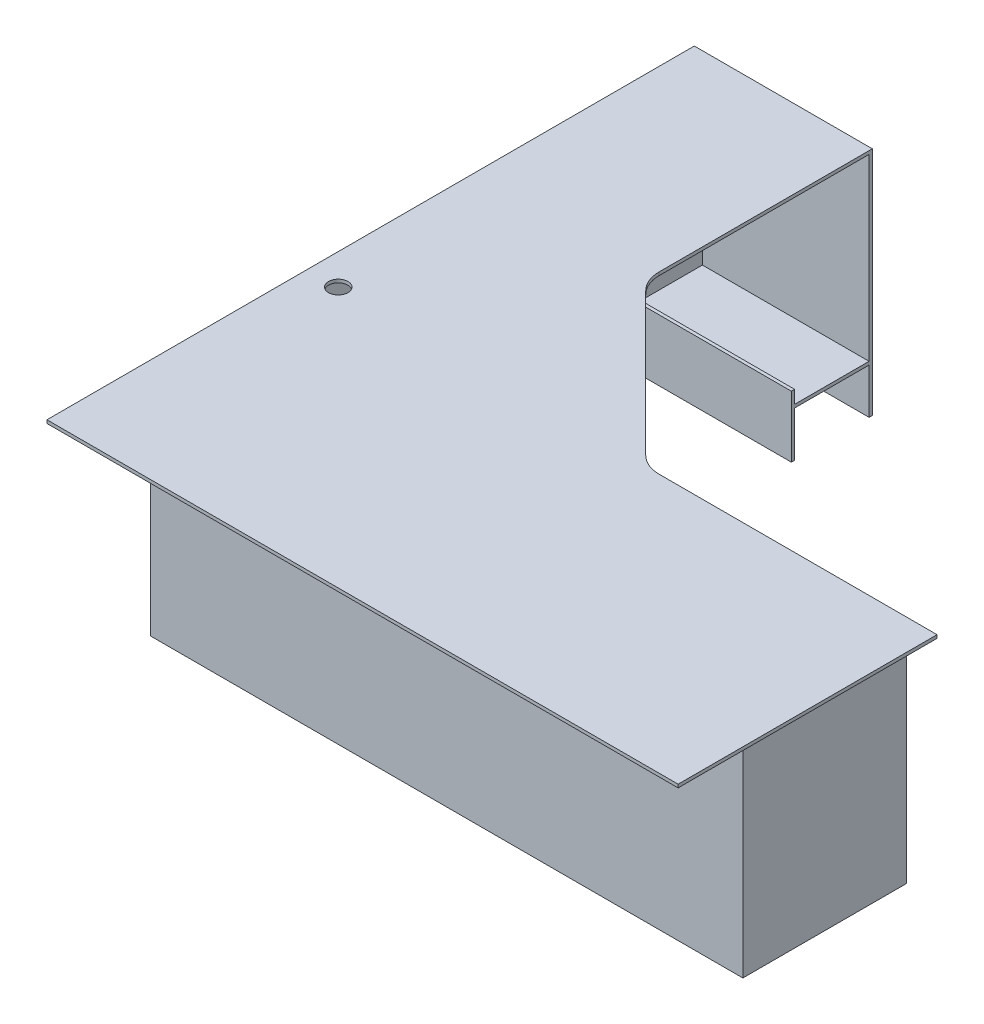
ISO-10303-21;
HEADER;
FILE_DESCRIPTION(('STEP AP214'),'2;1');
FILE_NAME('part.step','',(''),(''),'','','');
FILE_SCHEMA(('AUTOMOTIVE_DESIGN { 1 0 10303 214 1 1 1 1 }'));
ENDSEC;
DATA;
#1=APPLICATION_CONTEXT('core data for automotive mechanical design processes');
#2=APPLICATION_PROTOCOL_DEFINITION('international standard','automotive_design',2000,#1);
#3=PRODUCT_CONTEXT('',#1,'mechanical');
#4=PRODUCT('Part','Part','',(#3));
#5=PRODUCT_RELATED_PRODUCT_CATEGORY('part','',(#4));
#6=PRODUCT_DEFINITION_FORMATION('','',#4);
#7=PRODUCT_DEFINITION_CONTEXT('part definition',#1,'design');
#8=PRODUCT_DEFINITION('design','',#6,#7);
#9=PRODUCT_DEFINITION_SHAPE('','',#8);
#10=(LENGTH_UNIT() NAMED_UNIT(*) SI_UNIT(.MILLI.,.METRE.));
#11=(NAMED_UNIT(*) PLANE_ANGLE_UNIT() SI_UNIT($,.RADIAN.));
#12=(NAMED_UNIT(*) SI_UNIT($,.STERADIAN.) SOLID_ANGLE_UNIT());
#13=UNCERTAINTY_MEASURE_WITH_UNIT(LENGTH_MEASURE(1.E-05),#10,'distance_accuracy_value','');
#14=(GEOMETRIC_REPRESENTATION_CONTEXT(3) GLOBAL_UNCERTAINTY_ASSIGNED_CONTEXT((#13)) GLOBAL_UNIT_ASSIGNED_CONTEXT((#10,
#11,#12)) REPRESENTATION_CONTEXT('',''));
#15=CARTESIAN_POINT('',(0.,0.,0.));
#16=DIRECTION('',(0.,0.,1.));
#17=DIRECTION('',(1.,0.,0.));
#18=AXIS2_PLACEMENT_3D('',#15,#16,#17);
#19=CARTESIAN_POINT('',(1630.,-75.0000000000001,-830.));
#20=DIRECTION('',(0.,0.,1.));
#21=DIRECTION('',(1.,0.,0.));
#22=AXIS2_PLACEMENT_3D('',#19,#20,#21);
#23=CYLINDRICAL_SURFACE('',#22,10.0000000000001);
#24=CARTESIAN_POINT('',(1630.,-75.0000000000001,-830.));
#25=DIRECTION('',(0.,0.,-1.));
#26=DIRECTION('',(-1.,0.,0.));
#27=AXIS2_PLACEMENT_3D('',#24,#25,#26);
#28=CIRCLE('',#27,10.0000000000001);
#29=CARTESIAN_POINT('',(1620.,-75.0000000000001,-830.));
#30=VERTEX_POINT('',#29);
#31=EDGE_CURVE('E11',#30,#30,#28,.T.);
#32=ORIENTED_EDGE('',*,*,#31,.F.);
#33=EDGE_LOOP('',(#32));
#34=FACE_BOUND('',#33,.T.);
#35=CARTESIAN_POINT('',(1630.,-75.0000000000001,-800.));
#36=DIRECTION('',(0.,0.,-1.));
#37=DIRECTION('',(-1.,0.,0.));
#38=AXIS2_PLACEMENT_3D('',#35,#36,#37);
#39=CIRCLE('',#38,10.0000000000001);
#40=CARTESIAN_POINT('',(1620.,-75.0000000000001,-800.));
#41=VERTEX_POINT('',#40);
#42=EDGE_CURVE('E45',#41,#41,#39,.T.);
#43=ORIENTED_EDGE('',*,*,#42,.T.);
#44=EDGE_LOOP('',(#43));
#45=FACE_BOUND('',#44,.T.);
#46=ADVANCED_FACE('F42',(#34,#45),#23,.T.);
#47=CARTESIAN_POINT('',(1630.,-75.0000000000001,-830.));
#48=DIRECTION('',(0.,0.,-1.));
#49=DIRECTION('',(-1.,0.,0.));
#50=AXIS2_PLACEMENT_3D('',#47,#48,#49);
#51=PLANE('',#50);
#52=ORIENTED_EDGE('',*,*,#31,.T.);
#53=EDGE_LOOP('',(#52));
#54=FACE_BOUND('',#53,.T.);
#55=ADVANCED_FACE('F57',(#54),#51,.T.);
#56=CARTESIAN_POINT('',(1630.,-75.0000000000001,-800.));
#57=DIRECTION('',(0.,0.,-1.));
#58=DIRECTION('',(-1.,0.,0.));
#59=AXIS2_PLACEMENT_3D('',#56,#57,#58);
#60=PLANE('',#59);
#61=ORIENTED_EDGE('',*,*,#42,.F.);
#62=EDGE_LOOP('',(#61));
#63=FACE_BOUND('',#62,.T.);
#64=ADVANCED_FACE('F55',(#63),#60,.F.);
#65=CLOSED_SHELL('',(#46,#55,#64));
#66=MANIFOLD_SOLID_BREP('B2',#65);
#67=CARTESIAN_POINT('',(1845.,-150.,-305.));
#68=DIRECTION('',(0.,0.,-1.));
#69=DIRECTION('',(-1.,0.,0.));
#70=AXIS2_PLACEMENT_3D('',#67,#68,#69);
#71=PLANE('',#70);
#72=DIRECTION('',(-1.,0.,0.));
#73=VECTOR('',#72,1.);
#74=CARTESIAN_POINT('',(1845.,0.,-305.));
#75=LINE('',#74,#73);
#76=CARTESIAN_POINT('',(1845.,0.,-305.));
#77=VERTEX_POINT('',#76);
#78=CARTESIAN_POINT('',(1515.,0.,-305.));
#79=VERTEX_POINT('',#78);
#80=EDGE_CURVE('E155',#77,#79,#75,.T.);
#81=ORIENTED_EDGE('',*,*,#80,.T.);
#82=DIRECTION('',(0.,1.,0.));
#83=VECTOR('',#82,1.);
#84=CARTESIAN_POINT('',(1515.,-150.,-305.));
#85=LINE('',#84,#83);
#86=CARTESIAN_POINT('',(1515.,-150.,-305.));
#87=VERTEX_POINT('',#86);
#88=EDGE_CURVE('E40',#87,#79,#85,.T.);
#89=ORIENTED_EDGE('',*,*,#88,.F.);
#90=DIRECTION('',(-1.,0.,0.));
#91=VECTOR('',#90,1.);
#92=CARTESIAN_POINT('',(1845.,-150.,-305.));
#93=LINE('',#92,#91);
#94=CARTESIAN_POINT('',(1845.,-150.,-305.));
#95=VERTEX_POINT('',#94);
#96=EDGE_CURVE('E143',#95,#87,#93,.T.);
#97=ORIENTED_EDGE('',*,*,#96,.F.);
#98=DIRECTION('',(0.,1.,0.));
#99=VECTOR('',#98,1.);
#100=CARTESIAN_POINT('',(1845.,-150.,-305.));
#101=LINE('',#100,#99);
#102=EDGE_CURVE('E151',#95,#77,#101,.T.);
#103=ORIENTED_EDGE('',*,*,#102,.T.);
#104=EDGE_LOOP('',(#81,#89,#97,#103));
#105=FACE_BOUND('',#104,.T.);
#106=ADVANCED_FACE('F92',(#105),#71,.F.);
#107=CARTESIAN_POINT('',(1515.,-150.,-305.));
#108=DIRECTION('',(1.,0.,0.));
#109=DIRECTION('',(0.,0.,-1.));
#110=AXIS2_PLACEMENT_3D('',#107,#108,#109);
#111=PLANE('',#110);
#112=DIRECTION('',(0.,0.,-1.));
#113=VECTOR('',#112,1.);
#114=CARTESIAN_POINT('',(1515.,0.,-305.));
#115=LINE('',#114,#113);
#116=CARTESIAN_POINT('',(1515.,0.,-800.));
#117=VERTEX_POINT('',#116);
#118=EDGE_CURVE('E147',#79,#117,#115,.T.);
#119=ORIENTED_EDGE('',*,*,#118,.T.);
#120=DIRECTION('',(0.,1.,0.));
#121=VECTOR('',#120,1.);
#122=CARTESIAN_POINT('',(1515.,-150.,-800.));
#123=LINE('',#122,#121);
#124=CARTESIAN_POINT('',(1515.,-150.,-800.));
#125=VERTEX_POINT('',#124);
#126=EDGE_CURVE('E100',#125,#117,#123,.T.);
#127=ORIENTED_EDGE('',*,*,#126,.F.);
#128=DIRECTION('',(0.,0.,-1.));
#129=VECTOR('',#128,1.);
#130=CARTESIAN_POINT('',(1515.,-150.,-305.));
#131=LINE('',#130,#129);
#132=EDGE_CURVE('E138',#87,#125,#131,.T.);
#133=ORIENTED_EDGE('',*,*,#132,.F.);
#134=ORIENTED_EDGE('',*,*,#88,.T.);
#135=EDGE_LOOP('',(#119,#127,#133,#134));
#136=FACE_BOUND('',#135,.T.);
#137=ADVANCED_FACE('F146',(#136),#111,.F.);
#138=CARTESIAN_POINT('',(1515.,-150.,-800.));
#139=DIRECTION('',(0.,0.,1.));
#140=DIRECTION('',(1.,0.,0.));
#141=AXIS2_PLACEMENT_3D('',#138,#139,#140);
#142=PLANE('',#141);
#143=DIRECTION('',(1.,0.,0.));
#144=VECTOR('',#143,1.);
#145=CARTESIAN_POINT('',(1515.,0.,-800.));
#146=LINE('',#145,#144);
#147=CARTESIAN_POINT('',(1845.,0.,-800.));
#148=VERTEX_POINT('',#147);
#149=EDGE_CURVE('E125',#117,#148,#146,.T.);
#150=ORIENTED_EDGE('',*,*,#149,.T.);
#151=DIRECTION('',(0.,1.,0.));
#152=VECTOR('',#151,1.);
#153=CARTESIAN_POINT('',(1845.,-150.,-800.));
#154=LINE('',#153,#152);
#155=CARTESIAN_POINT('',(1845.,-150.,-800.));
#156=VERTEX_POINT('',#155);
#157=EDGE_CURVE('E148',#156,#148,#154,.T.);
#158=ORIENTED_EDGE('',*,*,#157,.F.);
#159=DIRECTION('',(1.,0.,0.));
#160=VECTOR('',#159,1.);
#161=CARTESIAN_POINT('',(1515.,-150.,-800.));
#162=LINE('',#161,#160);
#163=EDGE_CURVE('E141',#125,#156,#162,.T.);
#164=ORIENTED_EDGE('',*,*,#163,.F.);
#165=ORIENTED_EDGE('',*,*,#126,.T.);
#166=EDGE_LOOP('',(#150,#158,#164,#165));
#167=FACE_BOUND('',#166,.T.);
#168=ADVANCED_FACE('F149',(#167),#142,.F.);
#169=CARTESIAN_POINT('',(1845.,-150.,-800.));
#170=DIRECTION('',(-1.,0.,0.));
#171=DIRECTION('',(0.,0.,1.));
#172=AXIS2_PLACEMENT_3D('',#169,#170,#171);
#173=PLANE('',#172);
#174=DIRECTION('',(0.,0.,1.));
#175=VECTOR('',#174,1.);
#176=CARTESIAN_POINT('',(1845.,0.,-800.));
#177=LINE('',#176,#175);
#178=EDGE_CURVE('E131',#148,#77,#177,.T.);
#179=ORIENTED_EDGE('',*,*,#178,.T.);
#180=ORIENTED_EDGE('',*,*,#102,.F.);
#181=DIRECTION('',(0.,0.,1.));
#182=VECTOR('',#181,1.);
#183=CARTESIAN_POINT('',(1845.,-150.,-800.));
#184=LINE('',#183,#182);
#185=EDGE_CURVE('E108',#156,#95,#184,.T.);
#186=ORIENTED_EDGE('',*,*,#185,.F.);
#187=ORIENTED_EDGE('',*,*,#157,.T.);
#188=EDGE_LOOP('',(#179,#180,#186,#187));
#189=FACE_BOUND('',#188,.T.);
#190=ADVANCED_FACE('F162',(#189),#173,.F.);
#191=CARTESIAN_POINT('',(0.,-150.,0.));
#192=DIRECTION('',(0.,-1.,0.));
#193=DIRECTION('',(0.,0.,-1.));
#194=AXIS2_PLACEMENT_3D('',#191,#192,#193);
#195=PLANE('',#194);
#196=ORIENTED_EDGE('',*,*,#96,.T.);
#197=ORIENTED_EDGE('',*,*,#132,.T.);
#198=ORIENTED_EDGE('',*,*,#163,.T.);
#199=ORIENTED_EDGE('',*,*,#185,.T.);
#200=EDGE_LOOP('',(#196,#197,#198,#199));
#201=FACE_BOUND('',#200,.T.);
#202=ADVANCED_FACE('F139',(#201),#195,.T.);
#203=CARTESIAN_POINT('',(0.,0.,0.));
#204=DIRECTION('',(0.,-1.,0.));
#205=DIRECTION('',(0.,0.,-1.));
#206=AXIS2_PLACEMENT_3D('',#203,#204,#205);
#207=PLANE('',#206);
#208=ORIENTED_EDGE('',*,*,#80,.F.);
#209=ORIENTED_EDGE('',*,*,#178,.F.);
#210=ORIENTED_EDGE('',*,*,#149,.F.);
#211=ORIENTED_EDGE('',*,*,#118,.F.);
#212=EDGE_LOOP('',(#208,#209,#210,#211));
#213=FACE_BOUND('',#212,.T.);
#214=ADVANCED_FACE('F165',(#213),#207,.F.);
#215=CLOSED_SHELL('',(#106,#137,#168,#190,#202,#214));
#216=MANIFOLD_SOLID_BREP('B6',#215);
#217=CARTESIAN_POINT('',(34.9999999999999,-703.6,-305.));
#218=DIRECTION('',(-1.,0.,0.));
#219=DIRECTION('',(0.,0.,1.));
#220=AXIS2_PLACEMENT_3D('',#217,#218,#219);
#221=PLANE('',#220);
#222=DIRECTION('',(0.,-1.,0.));
#223=VECTOR('',#222,1.);
#224=CARTESIAN_POINT('',(35.0000000000002,-513.600000000001,-1990.));
#225=LINE('',#224,#223);
#226=CARTESIAN_POINT('',(35.,0.,-1990.));
#227=VERTEX_POINT('',#226);
#228=CARTESIAN_POINT('',(35.0000000000002,-553.600000000001,-1990.));
#229=VERTEX_POINT('',#228);
#230=EDGE_CURVE('E241',#227,#229,#225,.T.);
#231=ORIENTED_EDGE('',*,*,#230,.F.);
#232=DIRECTION('',(0.,0.,1.));
#233=VECTOR('',#232,1.);
#234=CARTESIAN_POINT('',(34.9999999999999,0.,-305.));
#235=LINE('',#234,#233);
#236=CARTESIAN_POINT('',(34.9999999999999,0.,-305.));
#237=VERTEX_POINT('',#236);
#238=EDGE_CURVE('E220',#227,#237,#235,.T.);
#239=ORIENTED_EDGE('',*,*,#238,.T.);
#240=DIRECTION('',(0.,1.,0.));
#241=VECTOR('',#240,1.);
#242=CARTESIAN_POINT('',(34.9999999999999,-703.6,-305.));
#243=LINE('',#242,#241);
#244=CARTESIAN_POINT('',(34.9999999999999,-703.6,-305.));
#245=VERTEX_POINT('',#244);
#246=EDGE_CURVE('E531',#245,#237,#243,.T.);
#247=ORIENTED_EDGE('',*,*,#246,.F.);
#248=DIRECTION('',(0.,0.,1.));
#249=VECTOR('',#248,1.);
#250=CARTESIAN_POINT('',(34.9999999999999,-703.6,-305.));
#251=LINE('',#250,#249);
#252=CARTESIAN_POINT('',(35.0000000000001,-703.6,-1750.));
#253=VERTEX_POINT('',#252);
#254=EDGE_CURVE('E396',#253,#245,#251,.T.);
#255=ORIENTED_EDGE('',*,*,#254,.F.);
#256=DIRECTION('',(0.,-1.,0.));
#257=VECTOR('',#256,1.);
#258=CARTESIAN_POINT('',(35.0000000000001,-703.6,-1750.));
#259=LINE('',#258,#257);
#260=CARTESIAN_POINT('',(35.0000000000001,-513.600000000001,-1750.));
#261=VERTEX_POINT('',#260);
#262=EDGE_CURVE('E390',#261,#253,#259,.T.);
#263=ORIENTED_EDGE('',*,*,#262,.F.);
#264=DIRECTION('',(0.,0.,1.));
#265=VECTOR('',#264,1.);
#266=CARTESIAN_POINT('',(35.0000000000001,-513.600000000001,-1750.));
#267=LINE('',#266,#265);
#268=CARTESIAN_POINT('',(35.0000000000001,-513.600000000001,-1760.));
#269=VERTEX_POINT('',#268);
#270=EDGE_CURVE('E394',#269,#261,#267,.T.);
#271=ORIENTED_EDGE('',*,*,#270,.F.);
#272=DIRECTION('',(0.,-1.,0.));
#273=VECTOR('',#272,1.);
#274=CARTESIAN_POINT('',(35.0000000000001,-513.600000000001,-1760.));
#275=LINE('',#274,#273);
#276=CARTESIAN_POINT('',(35.0000000000001,-553.600000000001,-1760.));
#277=VERTEX_POINT('',#276);
#278=EDGE_CURVE('E422',#269,#277,#275,.T.);
#279=ORIENTED_EDGE('',*,*,#278,.T.);
#280=DIRECTION('',(0.,0.,1.));
#281=VECTOR('',#280,1.);
#282=CARTESIAN_POINT('',(35.0000000000001,-553.6,-1750.));
#283=LINE('',#282,#281);
#284=EDGE_CURVE('E401',#229,#277,#283,.T.);
#285=ORIENTED_EDGE('',*,*,#284,.F.);
#286=EDGE_LOOP('',(#231,#239,#247,#255,#263,#271,#279,#285));
#287=FACE_BOUND('',#286,.T.);
#288=ADVANCED_FACE('F216',(#287),#221,.F.);
#289=CARTESIAN_POINT('',(0.,0.,0.));
#290=DIRECTION('',(0.,-1.,0.));
#291=DIRECTION('',(0.,0.,-1.));
#292=AXIS2_PLACEMENT_3D('',#289,#290,#291);
#293=PLANE('',#292);
#294=CARTESIAN_POINT('',(95.,0.,-805.));
#295=DIRECTION('',(0.,-1.,0.));
#296=DIRECTION('',(0.,0.,-1.));
#297=AXIS2_PLACEMENT_3D('',#294,#295,#296);
#298=CIRCLE('',#297,30.);
#299=CARTESIAN_POINT('',(95.,0.,-835.));
#300=VERTEX_POINT('',#299);
#301=EDGE_CURVE('E467',#300,#300,#298,.T.);
#302=ORIENTED_EDGE('',*,*,#301,.F.);
#303=EDGE_LOOP('',(#302));
#304=FACE_BOUND('',#303,.T.);
#305=ORIENTED_EDGE('',*,*,#238,.F.);
#306=DIRECTION('',(-1.,0.,0.));
#307=VECTOR('',#306,1.);
#308=CARTESIAN_POINT('',(35.0000000000002,0.,-1990.));
#309=LINE('',#308,#307);
#310=CARTESIAN_POINT('',(550.,0.,-1990.));
#311=VERTEX_POINT('',#310);
#312=EDGE_CURVE('E417',#311,#227,#309,.T.);
#313=ORIENTED_EDGE('',*,*,#312,.F.);
#314=DIRECTION('',(0.,0.,-1.));
#315=VECTOR('',#314,1.);
#316=CARTESIAN_POINT('',(550.,0.,-2000.));
#317=LINE('',#316,#315);
#318=CARTESIAN_POINT('',(550.,0.,-1341.42135623731));
#319=VERTEX_POINT('',#318);
#320=EDGE_CURVE('E573',#319,#311,#317,.T.);
#321=ORIENTED_EDGE('',*,*,#320,.F.);
#322=CARTESIAN_POINT('',(650.,0.,-1341.42135623731));
#323=DIRECTION('',(0.,-1.,0.));
#324=DIRECTION('',(0.,0.,-1.));
#325=AXIS2_PLACEMENT_3D('',#322,#323,#324);
#326=CIRCLE('',#325,100.);
#327=CARTESIAN_POINT('',(579.289321881345,0.,-1270.71067811866));
#328=VERTEX_POINT('',#327);
#329=EDGE_CURVE('E226',#319,#328,#326,.F.);
#330=ORIENTED_EDGE('',*,*,#329,.T.);
#331=DIRECTION('',(-0.707106781186546,0.,-0.707106781186549));
#332=VECTOR('',#331,1.);
#333=CARTESIAN_POINT('',(550.,0.,-1300.));
#334=LINE('',#333,#332);
#335=CARTESIAN_POINT('',(1020.71067811865,0.,-829.289321881345));
#336=VERTEX_POINT('',#335);
#337=EDGE_CURVE('E562',#336,#328,#334,.T.);
#338=ORIENTED_EDGE('',*,*,#337,.F.);
#339=CARTESIAN_POINT('',(1091.42135623731,0.,-900.));
#340=DIRECTION('',(0.,-1.,0.));
#341=DIRECTION('',(0.,0.,-1.));
#342=AXIS2_PLACEMENT_3D('',#339,#340,#341);
#343=CIRCLE('',#342,100.);
#344=CARTESIAN_POINT('',(1091.42135623731,0.,-800.));
#345=VERTEX_POINT('',#344);
#346=EDGE_CURVE('E610',#336,#345,#343,.F.);
#347=ORIENTED_EDGE('',*,*,#346,.T.);
#348=DIRECTION('',(-1.,0.,0.));
#349=VECTOR('',#348,1.);
#350=CARTESIAN_POINT('',(1050.,0.,-800.));
#351=LINE('',#350,#349);
#352=CARTESIAN_POINT('',(1845.,0.,-800.));
#353=VERTEX_POINT('',#352);
#354=EDGE_CURVE('E559',#353,#345,#351,.T.);
#355=ORIENTED_EDGE('',*,*,#354,.F.);
#356=DIRECTION('',(0.,0.,-1.));
#357=VECTOR('',#356,1.);
#358=CARTESIAN_POINT('',(1845.,0.,-800.));
#359=LINE('',#358,#357);
#360=CARTESIAN_POINT('',(1845.,0.,-305.));
#361=VERTEX_POINT('',#360);
#362=EDGE_CURVE('E507',#361,#353,#359,.T.);
#363=ORIENTED_EDGE('',*,*,#362,.F.);
#364=DIRECTION('',(1.,0.,0.));
#365=VECTOR('',#364,1.);
#366=CARTESIAN_POINT('',(1845.,0.,-305.));
#367=LINE('',#366,#365);
#368=EDGE_CURVE('E496',#237,#361,#367,.T.);
#369=ORIENTED_EDGE('',*,*,#368,.F.);
#370=EDGE_LOOP('',(#305,#313,#321,#330,#338,#347,#355,#363,#369));
#371=FACE_BOUND('',#370,.T.);
#372=ADVANCED_FACE('F617',(#304,#371),#293,.T.);
#373=CARTESIAN_POINT('',(550.,-553.6,-1750.));
#374=DIRECTION('',(0.,-1.,0.));
#375=DIRECTION('',(0.,0.,-1.));
#376=AXIS2_PLACEMENT_3D('',#373,#374,#375);
#377=PLANE('',#376);
#378=DIRECTION('',(-1.,0.,0.));
#379=VECTOR('',#378,1.);
#380=CARTESIAN_POINT('',(35.0000000000001,-553.600000000001,-1760.));
#381=LINE('',#380,#379);
#382=CARTESIAN_POINT('',(550.,-553.600000000001,-1760.));
#383=VERTEX_POINT('',#382);
#384=EDGE_CURVE('E415',#383,#277,#381,.T.);
#385=ORIENTED_EDGE('',*,*,#384,.F.);
#386=DIRECTION('',(0.,0.,1.));
#387=VECTOR('',#386,1.);
#388=CARTESIAN_POINT('',(550.,-553.6,-1750.));
#389=LINE('',#388,#387);
#390=CARTESIAN_POINT('',(550.,-553.6,-1990.));
#391=VERTEX_POINT('',#390);
#392=EDGE_CURVE('E443',#391,#383,#389,.T.);
#393=ORIENTED_EDGE('',*,*,#392,.F.);
#394=DIRECTION('',(1.,0.,0.));
#395=VECTOR('',#394,1.);
#396=CARTESIAN_POINT('',(550.,-553.600000000001,-1990.));
#397=LINE('',#396,#395);
#398=EDGE_CURVE('E427',#229,#391,#397,.T.);
#399=ORIENTED_EDGE('',*,*,#398,.F.);
#400=ORIENTED_EDGE('',*,*,#284,.T.);
#401=EDGE_LOOP('',(#385,#393,#399,#400));
#402=FACE_BOUND('',#401,.T.);
#403=ADVANCED_FACE('F671',(#402),#377,.F.);
#404=DIRECTION('',(0.,1.,0.));
#405=VECTOR('',#404,1.);
#406=CARTESIAN_POINT('',(35.0000000000001,-703.6,-1760.));
#407=LINE('',#406,#405);
#408=CARTESIAN_POINT('',(35.0000000000001,-703.6,-1760.));
#409=VERTEX_POINT('',#408);
#410=CARTESIAN_POINT('',(35.0000000000001,-563.6,-1760.));
#411=VERTEX_POINT('',#410);
#412=EDGE_CURVE('E431',#409,#411,#407,.T.);
#413=ORIENTED_EDGE('',*,*,#412,.F.);
#414=CARTESIAN_POINT('',(35.,-703.6,-1990.));
#415=VERTEX_POINT('',#414);
#416=EDGE_CURVE('E482',#415,#409,#251,.T.);
#417=ORIENTED_EDGE('',*,*,#416,.F.);
#418=DIRECTION('',(0.,-1.,0.));
#419=VECTOR('',#418,1.);
#420=CARTESIAN_POINT('',(35.0000000000002,-563.6,-1990.));
#421=LINE('',#420,#419);
#422=CARTESIAN_POINT('',(35.0000000000002,-563.6,-1990.));
#423=VERTEX_POINT('',#422);
#424=EDGE_CURVE('E451',#423,#415,#421,.T.);
#425=ORIENTED_EDGE('',*,*,#424,.F.);
#426=DIRECTION('',(0.,0.,-1.));
#427=VECTOR('',#426,1.);
#428=CARTESIAN_POINT('',(35.0000000000001,-563.6,-1760.));
#429=LINE('',#428,#427);
#430=EDGE_CURVE('E449',#411,#423,#429,.T.);
#431=ORIENTED_EDGE('',*,*,#430,.F.);
#432=EDGE_LOOP('',(#413,#417,#425,#431));
#433=FACE_BOUND('',#432,.T.);
#434=ADVANCED_FACE('F687',(#433),#221,.F.);
#435=DIRECTION('',(0.,0.,-1.));
#436=VECTOR('',#435,1.);
#437=CARTESIAN_POINT('',(25.,0.,-2000.));
#438=LINE('',#437,#436);
#439=CARTESIAN_POINT('',(25.,0.,-295.));
#440=VERTEX_POINT('',#439);
#441=CARTESIAN_POINT('',(25.,0.,-2000.));
#442=VERTEX_POINT('',#441);
#443=EDGE_CURVE('E471',#440,#442,#438,.T.);
#444=ORIENTED_EDGE('',*,*,#443,.F.);
#445=DIRECTION('',(-1.,0.,0.));
#446=VECTOR('',#445,1.);
#447=CARTESIAN_POINT('',(25.,0.,-295.));
#448=LINE('',#447,#446);
#449=CARTESIAN_POINT('',(1855.,0.,-295.));
#450=VERTEX_POINT('',#449);
#451=EDGE_CURVE('E478',#450,#440,#448,.T.);
#452=ORIENTED_EDGE('',*,*,#451,.F.);
#453=DIRECTION('',(0.,0.,1.));
#454=VECTOR('',#453,1.);
#455=CARTESIAN_POINT('',(1855.,0.,-295.));
#456=LINE('',#455,#454);
#457=CARTESIAN_POINT('',(1855.,0.,-800.));
#458=VERTEX_POINT('',#457);
#459=EDGE_CURVE('E504',#458,#450,#456,.T.);
#460=ORIENTED_EDGE('',*,*,#459,.F.);
#461=CARTESIAN_POINT('',(1950.,0.,-800.));
#462=VERTEX_POINT('',#461);
#463=EDGE_CURVE('E567',#462,#458,#351,.T.);
#464=ORIENTED_EDGE('',*,*,#463,.F.);
#465=DIRECTION('',(0.,0.,-1.));
#466=VECTOR('',#465,1.);
#467=CARTESIAN_POINT('',(1950.,0.,-800.));
#468=LINE('',#467,#466);
#469=CARTESIAN_POINT('',(1950.,0.,0.));
#470=VERTEX_POINT('',#469);
#471=EDGE_CURVE('E557',#470,#462,#468,.T.);
#472=ORIENTED_EDGE('',*,*,#471,.F.);
#473=DIRECTION('',(1.,0.,0.));
#474=VECTOR('',#473,1.);
#475=CARTESIAN_POINT('',(1950.,0.,0.));
#476=LINE('',#475,#474);
#477=CARTESIAN_POINT('',(0.,0.,0.));
#478=VERTEX_POINT('',#477);
#479=EDGE_CURVE('E554',#478,#470,#476,.T.);
#480=ORIENTED_EDGE('',*,*,#479,.F.);
#481=DIRECTION('',(0.,0.,1.));
#482=VECTOR('',#481,1.);
#483=CARTESIAN_POINT('',(0.,0.,0.));
#484=LINE('',#483,#482);
#485=CARTESIAN_POINT('',(0.,0.,-2000.));
#486=VERTEX_POINT('',#485);
#487=EDGE_CURVE('E539',#486,#478,#484,.T.);
#488=ORIENTED_EDGE('',*,*,#487,.F.);
#489=DIRECTION('',(-1.,0.,0.));
#490=VECTOR('',#489,1.);
#491=CARTESIAN_POINT('',(0.,0.,-2000.));
#492=LINE('',#491,#490);
#493=EDGE_CURVE('E570',#442,#486,#492,.T.);
#494=ORIENTED_EDGE('',*,*,#493,.F.);
#495=EDGE_LOOP('',(#444,#452,#460,#464,#472,#480,#488,#494));
#496=FACE_BOUND('',#495,.T.);
#497=ADVANCED_FACE('F645',(#496),#293,.T.);
#498=CARTESIAN_POINT('',(1950.,10.,0.));
#499=DIRECTION('',(0.,0.,-1.));
#500=DIRECTION('',(-1.,0.,0.));
#501=AXIS2_PLACEMENT_3D('',#498,#499,#500);
#502=PLANE('',#501);
#503=ORIENTED_EDGE('',*,*,#479,.T.);
#504=DIRECTION('',(0.,-1.,0.));
#505=VECTOR('',#504,1.);
#506=CARTESIAN_POINT('',(1950.,10.,0.));
#507=LINE('',#506,#505);
#508=CARTESIAN_POINT('',(1950.,10.,0.));
#509=VERTEX_POINT('',#508);
#510=EDGE_CURVE('E574',#509,#470,#507,.T.);
#511=ORIENTED_EDGE('',*,*,#510,.F.);
#512=DIRECTION('',(1.,0.,0.));
#513=VECTOR('',#512,1.);
#514=CARTESIAN_POINT('',(1950.,10.,0.));
#515=LINE('',#514,#513);
#516=CARTESIAN_POINT('',(0.,10.,0.));
#517=VERTEX_POINT('',#516);
#518=EDGE_CURVE('E535',#517,#509,#515,.T.);
#519=ORIENTED_EDGE('',*,*,#518,.F.);
#520=DIRECTION('',(0.,-1.,0.));
#521=VECTOR('',#520,1.);
#522=CARTESIAN_POINT('',(0.,10.,0.));
#523=LINE('',#522,#521);
#524=EDGE_CURVE('E553',#517,#478,#523,.T.);
#525=ORIENTED_EDGE('',*,*,#524,.T.);
#526=EDGE_LOOP('',(#503,#511,#519,#525));
#527=FACE_BOUND('',#526,.T.);
#528=ADVANCED_FACE('F643',(#527),#502,.F.);
#529=CARTESIAN_POINT('',(1950.,10.,-800.));
#530=DIRECTION('',(-1.,0.,0.));
#531=DIRECTION('',(0.,0.,1.));
#532=AXIS2_PLACEMENT_3D('',#529,#530,#531);
#533=PLANE('',#532);
#534=ORIENTED_EDGE('',*,*,#471,.T.);
#535=DIRECTION('',(0.,-1.,0.));
#536=VECTOR('',#535,1.);
#537=CARTESIAN_POINT('',(1950.,10.,-800.));
#538=LINE('',#537,#536);
#539=CARTESIAN_POINT('',(1950.,10.,-800.));
#540=VERTEX_POINT('',#539);
#541=EDGE_CURVE('E585',#540,#462,#538,.T.);
#542=ORIENTED_EDGE('',*,*,#541,.F.);
#543=DIRECTION('',(0.,0.,-1.));
#544=VECTOR('',#543,1.);
#545=CARTESIAN_POINT('',(1950.,10.,-800.));
#546=LINE('',#545,#544);
#547=EDGE_CURVE('E538',#509,#540,#546,.T.);
#548=ORIENTED_EDGE('',*,*,#547,.F.);
#549=ORIENTED_EDGE('',*,*,#510,.T.);
#550=EDGE_LOOP('',(#534,#542,#548,#549));
#551=FACE_BOUND('',#550,.T.);
#552=ADVANCED_FACE('F646',(#551),#533,.F.);
#553=CARTESIAN_POINT('',(1050.,10.,-800.));
#554=DIRECTION('',(0.,0.,1.));
#555=DIRECTION('',(1.,0.,0.));
#556=AXIS2_PLACEMENT_3D('',#553,#554,#555);
#557=PLANE('',#556);
#558=ORIENTED_EDGE('',*,*,#354,.T.);
#559=DIRECTION('',(0.,-1.,0.));
#560=VECTOR('',#559,1.);
#561=CARTESIAN_POINT('',(1091.42135623731,10.,-800.));
#562=LINE('',#561,#560);
#563=CARTESIAN_POINT('',(1091.42135623731,10.,-800.));
#564=VERTEX_POINT('',#563);
#565=EDGE_CURVE('E602',#345,#564,#562,.F.);
#566=ORIENTED_EDGE('',*,*,#565,.T.);
#567=DIRECTION('',(-1.,0.,0.));
#568=VECTOR('',#567,1.);
#569=CARTESIAN_POINT('',(1050.,10.,-800.));
#570=LINE('',#569,#568);
#571=EDGE_CURVE('E541',#540,#564,#570,.T.);
#572=ORIENTED_EDGE('',*,*,#571,.F.);
#573=ORIENTED_EDGE('',*,*,#541,.T.);
#574=ORIENTED_EDGE('',*,*,#463,.T.);
#575=DIRECTION('',(0.,1.,0.));
#576=VECTOR('',#575,1.);
#577=CARTESIAN_POINT('',(1855.,-703.6,-800.));
#578=LINE('',#577,#576);
#579=CARTESIAN_POINT('',(1855.,-703.6,-800.));
#580=VERTEX_POINT('',#579);
#581=EDGE_CURVE('E510',#580,#458,#578,.T.);
#582=ORIENTED_EDGE('',*,*,#581,.F.);
#583=DIRECTION('',(1.,0.,0.));
#584=VECTOR('',#583,1.);
#585=CARTESIAN_POINT('',(1855.,-703.6,-800.));
#586=LINE('',#585,#584);
#587=CARTESIAN_POINT('',(1845.,-703.6,-800.));
#588=VERTEX_POINT('',#587);
#589=EDGE_CURVE('E487',#588,#580,#586,.T.);
#590=ORIENTED_EDGE('',*,*,#589,.F.);
#591=DIRECTION('',(0.,1.,0.));
#592=VECTOR('',#591,1.);
#593=CARTESIAN_POINT('',(1845.,-703.6,-800.));
#594=LINE('',#593,#592);
#595=EDGE_CURVE('E513',#588,#353,#594,.T.);
#596=ORIENTED_EDGE('',*,*,#595,.T.);
#597=EDGE_LOOP('',(#558,#566,#572,#573,#574,#582,#590,#596));
#598=FACE_BOUND('',#597,.T.);
#599=ADVANCED_FACE('F648',(#598),#557,.F.);
#600=CARTESIAN_POINT('',(550.,10.,-1300.));
#601=DIRECTION('',(-0.707106781186549,0.,0.707106781186546));
#602=DIRECTION('',(0.707106781186546,0.,0.707106781186549));
#603=AXIS2_PLACEMENT_3D('',#600,#601,#602);
#604=PLANE('',#603);
#605=DIRECTION('',(-0.707106781186546,0.,-0.707106781186549));
#606=VECTOR('',#605,1.);
#607=CARTESIAN_POINT('',(550.,10.,-1300.));
#608=LINE('',#607,#606);
#609=CARTESIAN_POINT('',(1020.71067811865,10.,-829.289321881345));
#610=VERTEX_POINT('',#609);
#611=CARTESIAN_POINT('',(579.289321881345,10.,-1270.71067811866));
#612=VERTEX_POINT('',#611);
#613=EDGE_CURVE('E544',#610,#612,#608,.T.);
#614=ORIENTED_EDGE('',*,*,#613,.F.);
#615=DIRECTION('',(0.,-1.,0.));
#616=VECTOR('',#615,1.);
#617=CARTESIAN_POINT('',(1020.71067811865,0.,-829.289321881345));
#618=LINE('',#617,#616);
#619=EDGE_CURVE('E595',#610,#336,#618,.T.);
#620=ORIENTED_EDGE('',*,*,#619,.T.);
#621=ORIENTED_EDGE('',*,*,#337,.T.);
#622=DIRECTION('',(0.,-1.,0.));
#623=VECTOR('',#622,1.);
#624=CARTESIAN_POINT('',(579.289321881345,10.,-1270.71067811866));
#625=LINE('',#624,#623);
#626=EDGE_CURVE('E592',#328,#612,#625,.F.);
#627=ORIENTED_EDGE('',*,*,#626,.T.);
#628=EDGE_LOOP('',(#614,#620,#621,#627));
#629=FACE_BOUND('',#628,.T.);
#630=ADVANCED_FACE('F621',(#629),#604,.F.);
#631=CARTESIAN_POINT('',(550.,10.,-2000.));
#632=DIRECTION('',(-1.,0.,0.));
#633=DIRECTION('',(0.,0.,1.));
#634=AXIS2_PLACEMENT_3D('',#631,#632,#633);
#635=PLANE('',#634);
#636=DIRECTION('',(0.,0.,-1.));
#637=VECTOR('',#636,1.);
#638=CARTESIAN_POINT('',(550.,10.,-2000.));
#639=LINE('',#638,#637);
#640=CARTESIAN_POINT('',(550.,10.,-1341.42135623731));
#641=VERTEX_POINT('',#640);
#642=CARTESIAN_POINT('',(550.,10.,-2000.));
#643=VERTEX_POINT('',#642);
#644=EDGE_CURVE('E547',#641,#643,#639,.T.);
#645=ORIENTED_EDGE('',*,*,#644,.F.);
#646=DIRECTION('',(0.,-1.,0.));
#647=VECTOR('',#646,1.);
#648=CARTESIAN_POINT('',(550.,0.,-1341.42135623731));
#649=LINE('',#648,#647);
#650=EDGE_CURVE('E607',#641,#319,#649,.T.);
#651=ORIENTED_EDGE('',*,*,#650,.T.);
#652=ORIENTED_EDGE('',*,*,#320,.T.);
#653=DIRECTION('',(0.,-1.,0.));
#654=VECTOR('',#653,1.);
#655=CARTESIAN_POINT('',(550.,-513.600000000001,-1990.));
#656=LINE('',#655,#654);
#657=EDGE_CURVE('E233',#311,#391,#656,.T.);
#658=ORIENTED_EDGE('',*,*,#657,.T.);
#659=ORIENTED_EDGE('',*,*,#392,.T.);
#660=DIRECTION('',(0.,-1.,0.));
#661=VECTOR('',#660,1.);
#662=CARTESIAN_POINT('',(550.,-513.600000000001,-1760.));
#663=LINE('',#662,#661);
#664=CARTESIAN_POINT('',(550.,-513.600000000001,-1760.));
#665=VERTEX_POINT('',#664);
#666=EDGE_CURVE('E425',#665,#383,#663,.T.);
#667=ORIENTED_EDGE('',*,*,#666,.F.);
#668=DIRECTION('',(0.,0.,-1.));
#669=VECTOR('',#668,1.);
#670=CARTESIAN_POINT('',(550.,-513.600000000001,-1760.));
#671=LINE('',#670,#669);
#672=CARTESIAN_POINT('',(550.,-513.600000000001,-1750.));
#673=VERTEX_POINT('',#672);
#674=EDGE_CURVE('E409',#673,#665,#671,.T.);
#675=ORIENTED_EDGE('',*,*,#674,.F.);
#676=DIRECTION('',(0.,-1.,0.));
#677=VECTOR('',#676,1.);
#678=CARTESIAN_POINT('',(550.,-703.6,-1750.));
#679=LINE('',#678,#677);
#680=CARTESIAN_POINT('',(550.,-703.6,-1750.));
#681=VERTEX_POINT('',#680);
#682=EDGE_CURVE('E406',#673,#681,#679,.T.);
#683=ORIENTED_EDGE('',*,*,#682,.T.);
#684=DIRECTION('',(0.,0.,-1.));
#685=VECTOR('',#684,1.);
#686=CARTESIAN_POINT('',(550.,-703.6,-1750.));
#687=LINE('',#686,#685);
#688=CARTESIAN_POINT('',(550.,-703.6,-1760.));
#689=VERTEX_POINT('',#688);
#690=EDGE_CURVE('E400',#681,#689,#687,.T.);
#691=ORIENTED_EDGE('',*,*,#690,.T.);
#692=DIRECTION('',(0.,1.,0.));
#693=VECTOR('',#692,1.);
#694=CARTESIAN_POINT('',(550.,-703.6,-1760.));
#695=LINE('',#694,#693);
#696=CARTESIAN_POINT('',(550.,-563.6,-1760.));
#697=VERTEX_POINT('',#696);
#698=EDGE_CURVE('E434',#689,#697,#695,.T.);
#699=ORIENTED_EDGE('',*,*,#698,.T.);
#700=DIRECTION('',(0.,0.,-1.));
#701=VECTOR('',#700,1.);
#702=CARTESIAN_POINT('',(550.,-563.6,-1760.));
#703=LINE('',#702,#701);
#704=CARTESIAN_POINT('',(550.,-563.6,-1990.));
#705=VERTEX_POINT('',#704);
#706=EDGE_CURVE('E436',#697,#705,#703,.T.);
#707=ORIENTED_EDGE('',*,*,#706,.T.);
#708=DIRECTION('',(0.,-1.,0.));
#709=VECTOR('',#708,1.);
#710=CARTESIAN_POINT('',(550.,-563.6,-1990.));
#711=LINE('',#710,#709);
#712=CARTESIAN_POINT('',(550.,-703.6,-1990.));
#713=VERTEX_POINT('',#712);
#714=EDGE_CURVE('E438',#705,#713,#711,.T.);
#715=ORIENTED_EDGE('',*,*,#714,.T.);
#716=DIRECTION('',(0.,0.,-1.));
#717=VECTOR('',#716,1.);
#718=CARTESIAN_POINT('',(550.,-703.6,-1990.));
#719=LINE('',#718,#717);
#720=CARTESIAN_POINT('',(550.,-703.6,-2000.));
#721=VERTEX_POINT('',#720);
#722=EDGE_CURVE('E440',#713,#721,#719,.T.);
#723=ORIENTED_EDGE('',*,*,#722,.T.);
#724=DIRECTION('',(0.,-1.,0.));
#725=VECTOR('',#724,1.);
#726=CARTESIAN_POINT('',(550.,10.,-2000.));
#727=LINE('',#726,#725);
#728=EDGE_CURVE('E584',#643,#721,#727,.T.);
#729=ORIENTED_EDGE('',*,*,#728,.F.);
#730=EDGE_LOOP('',(#645,#651,#652,#658,#659,#667,#675,#683,#691,#699,#707,#715,#723,#729));
#731=FACE_BOUND('',#730,.T.);
#732=ADVANCED_FACE('F629',(#731),#635,.F.);
#733=CARTESIAN_POINT('',(0.,10.,-2000.));
#734=DIRECTION('',(0.,0.,1.));
#735=DIRECTION('',(1.,0.,0.));
#736=AXIS2_PLACEMENT_3D('',#733,#734,#735);
#737=PLANE('',#736);
#738=ORIENTED_EDGE('',*,*,#728,.T.);
#739=DIRECTION('',(1.,0.,0.));
#740=VECTOR('',#739,1.);
#741=CARTESIAN_POINT('',(35.,-703.6,-2000.));
#742=LINE('',#741,#740);
#743=CARTESIAN_POINT('',(25.,-703.6,-2000.));
#744=VERTEX_POINT('',#743);
#745=EDGE_CURVE('E477',#744,#721,#742,.T.);
#746=ORIENTED_EDGE('',*,*,#745,.F.);
#747=DIRECTION('',(0.,1.,0.));
#748=VECTOR('',#747,1.);
#749=CARTESIAN_POINT('',(25.,-703.6,-2000.));
#750=LINE('',#749,#748);
#751=EDGE_CURVE('E534',#744,#442,#750,.T.);
#752=ORIENTED_EDGE('',*,*,#751,.T.);
#753=ORIENTED_EDGE('',*,*,#493,.T.);
#754=DIRECTION('',(0.,-1.,0.));
#755=VECTOR('',#754,1.);
#756=CARTESIAN_POINT('',(0.,10.,-2000.));
#757=LINE('',#756,#755);
#758=CARTESIAN_POINT('',(0.,10.,-2000.));
#759=VERTEX_POINT('',#758);
#760=EDGE_CURVE('E581',#759,#486,#757,.T.);
#761=ORIENTED_EDGE('',*,*,#760,.F.);
#762=DIRECTION('',(-1.,0.,0.));
#763=VECTOR('',#762,1.);
#764=CARTESIAN_POINT('',(0.,10.,-2000.));
#765=LINE('',#764,#763);
#766=EDGE_CURVE('E549',#643,#759,#765,.T.);
#767=ORIENTED_EDGE('',*,*,#766,.F.);
#768=EDGE_LOOP('',(#738,#746,#752,#753,#761,#767));
#769=FACE_BOUND('',#768,.T.);
#770=ADVANCED_FACE('F634',(#769),#737,.F.);
#771=CARTESIAN_POINT('',(0.,10.,0.));
#772=DIRECTION('',(1.,0.,0.));
#773=DIRECTION('',(0.,0.,-1.));
#774=AXIS2_PLACEMENT_3D('',#771,#772,#773);
#775=PLANE('',#774);
#776=ORIENTED_EDGE('',*,*,#487,.T.);
#777=ORIENTED_EDGE('',*,*,#524,.F.);
#778=DIRECTION('',(0.,0.,1.));
#779=VECTOR('',#778,1.);
#780=CARTESIAN_POINT('',(0.,10.,0.));
#781=LINE('',#780,#779);
#782=EDGE_CURVE('E551',#759,#517,#781,.T.);
#783=ORIENTED_EDGE('',*,*,#782,.F.);
#784=ORIENTED_EDGE('',*,*,#760,.T.);
#785=EDGE_LOOP('',(#776,#777,#783,#784));
#786=FACE_BOUND('',#785,.T.);
#787=ADVANCED_FACE('F639',(#786),#775,.F.);
#788=CARTESIAN_POINT('',(0.,10.,0.));
#789=DIRECTION('',(0.,-1.,0.));
#790=DIRECTION('',(0.,0.,-1.));
#791=AXIS2_PLACEMENT_3D('',#788,#789,#790);
#792=PLANE('',#791);
#793=CARTESIAN_POINT('',(95.,10.,-805.));
#794=DIRECTION('',(0.,-1.,0.));
#795=DIRECTION('',(0.,0.,-1.));
#796=AXIS2_PLACEMENT_3D('',#793,#794,#795);
#797=CIRCLE('',#796,30.);
#798=CARTESIAN_POINT('',(95.,10.,-835.));
#799=VERTEX_POINT('',#798);
#800=EDGE_CURVE('E468',#799,#799,#797,.T.);
#801=ORIENTED_EDGE('',*,*,#800,.T.);
#802=EDGE_LOOP('',(#801));
#803=FACE_BOUND('',#802,.T.);
#804=ORIENTED_EDGE('',*,*,#518,.T.);
#805=ORIENTED_EDGE('',*,*,#547,.T.);
#806=ORIENTED_EDGE('',*,*,#571,.T.);
#807=CARTESIAN_POINT('',(1091.42135623731,10.,-900.));
#808=DIRECTION('',(0.,-1.,0.));
#809=DIRECTION('',(0.,0.,-1.));
#810=AXIS2_PLACEMENT_3D('',#807,#808,#809);
#811=CIRCLE('',#810,100.);
#812=EDGE_CURVE('E612',#564,#610,#811,.T.);
#813=ORIENTED_EDGE('',*,*,#812,.T.);
#814=ORIENTED_EDGE('',*,*,#613,.T.);
#815=CARTESIAN_POINT('',(650.,10.,-1341.42135623731));
#816=DIRECTION('',(0.,-1.,0.));
#817=DIRECTION('',(0.,0.,-1.));
#818=AXIS2_PLACEMENT_3D('',#815,#816,#817);
#819=CIRCLE('',#818,100.);
#820=EDGE_CURVE('E90',#612,#641,#819,.T.);
#821=ORIENTED_EDGE('',*,*,#820,.T.);
#822=ORIENTED_EDGE('',*,*,#644,.T.);
#823=ORIENTED_EDGE('',*,*,#766,.T.);
#824=ORIENTED_EDGE('',*,*,#782,.T.);
#825=EDGE_LOOP('',(#804,#805,#806,#813,#814,#821,#822,#823,#824));
#826=FACE_BOUND('',#825,.T.);
#827=ADVANCED_FACE('F626',(#803,#826),#792,.F.);
#828=CARTESIAN_POINT('',(25.,-703.6,-2000.));
#829=DIRECTION('',(1.,0.,0.));
#830=DIRECTION('',(0.,0.,-1.));
#831=AXIS2_PLACEMENT_3D('',#828,#829,#830);
#832=PLANE('',#831);
#833=ORIENTED_EDGE('',*,*,#443,.T.);
#834=ORIENTED_EDGE('',*,*,#751,.F.);
#835=DIRECTION('',(0.,0.,-1.));
#836=VECTOR('',#835,1.);
#837=CARTESIAN_POINT('',(25.,-703.6,-2000.));
#838=LINE('',#837,#836);
#839=CARTESIAN_POINT('',(25.,-703.6,-295.));
#840=VERTEX_POINT('',#839);
#841=EDGE_CURVE('E474',#840,#744,#838,.T.);
#842=ORIENTED_EDGE('',*,*,#841,.F.);
#843=DIRECTION('',(0.,1.,0.));
#844=VECTOR('',#843,1.);
#845=CARTESIAN_POINT('',(25.,-703.6,-295.));
#846=LINE('',#845,#844);
#847=EDGE_CURVE('E493',#840,#440,#846,.T.);
#848=ORIENTED_EDGE('',*,*,#847,.T.);
#849=EDGE_LOOP('',(#833,#834,#842,#848));
#850=FACE_BOUND('',#849,.T.);
#851=ADVANCED_FACE('F701',(#850),#832,.F.);
#852=CARTESIAN_POINT('',(1845.,-703.6,-305.));
#853=DIRECTION('',(0.,0.,1.));
#854=DIRECTION('',(1.,0.,0.));
#855=AXIS2_PLACEMENT_3D('',#852,#853,#854);
#856=PLANE('',#855);
#857=ORIENTED_EDGE('',*,*,#368,.T.);
#858=DIRECTION('',(0.,1.,0.));
#859=VECTOR('',#858,1.);
#860=CARTESIAN_POINT('',(1845.,-703.6,-305.));
#861=LINE('',#860,#859);
#862=CARTESIAN_POINT('',(1845.,-703.6,-305.));
#863=VERTEX_POINT('',#862);
#864=EDGE_CURVE('E528',#863,#361,#861,.T.);
#865=ORIENTED_EDGE('',*,*,#864,.F.);
#866=DIRECTION('',(1.,0.,0.));
#867=VECTOR('',#866,1.);
#868=CARTESIAN_POINT('',(1845.,-703.6,-305.));
#869=LINE('',#868,#867);
#870=EDGE_CURVE('E483',#245,#863,#869,.T.);
#871=ORIENTED_EDGE('',*,*,#870,.F.);
#872=ORIENTED_EDGE('',*,*,#246,.T.);
#873=EDGE_LOOP('',(#857,#865,#871,#872));
#874=FACE_BOUND('',#873,.T.);
#875=ADVANCED_FACE('F664',(#874),#856,.F.);
#876=CARTESIAN_POINT('',(1845.,-703.6,-800.));
#877=DIRECTION('',(1.,0.,0.));
#878=DIRECTION('',(0.,0.,-1.));
#879=AXIS2_PLACEMENT_3D('',#876,#877,#878);
#880=PLANE('',#879);
#881=ORIENTED_EDGE('',*,*,#362,.T.);
#882=ORIENTED_EDGE('',*,*,#595,.F.);
#883=DIRECTION('',(0.,0.,-1.));
#884=VECTOR('',#883,1.);
#885=CARTESIAN_POINT('',(1845.,-703.6,-800.));
#886=LINE('',#885,#884);
#887=EDGE_CURVE('E485',#863,#588,#886,.T.);
#888=ORIENTED_EDGE('',*,*,#887,.F.);
#889=ORIENTED_EDGE('',*,*,#864,.T.);
#890=EDGE_LOOP('',(#881,#882,#888,#889));
#891=FACE_BOUND('',#890,.T.);
#892=ADVANCED_FACE('F659',(#891),#880,.F.);
#893=CARTESIAN_POINT('',(1855.,-703.6,-295.));
#894=DIRECTION('',(-1.,0.,0.));
#895=DIRECTION('',(0.,0.,1.));
#896=AXIS2_PLACEMENT_3D('',#893,#894,#895);
#897=PLANE('',#896);
#898=ORIENTED_EDGE('',*,*,#459,.T.);
#899=DIRECTION('',(0.,1.,0.));
#900=VECTOR('',#899,1.);
#901=CARTESIAN_POINT('',(1855.,-703.6,-295.));
#902=LINE('',#901,#900);
#903=CARTESIAN_POINT('',(1855.,-703.6,-295.));
#904=VERTEX_POINT('',#903);
#905=EDGE_CURVE('E514',#904,#450,#902,.T.);
#906=ORIENTED_EDGE('',*,*,#905,.F.);
#907=DIRECTION('',(0.,0.,1.));
#908=VECTOR('',#907,1.);
#909=CARTESIAN_POINT('',(1855.,-703.6,-295.));
#910=LINE('',#909,#908);
#911=EDGE_CURVE('E489',#580,#904,#910,.T.);
#912=ORIENTED_EDGE('',*,*,#911,.F.);
#913=ORIENTED_EDGE('',*,*,#581,.T.);
#914=EDGE_LOOP('',(#898,#906,#912,#913));
#915=FACE_BOUND('',#914,.T.);
#916=ADVANCED_FACE('F709',(#915),#897,.F.);
#917=CARTESIAN_POINT('',(25.,-703.6,-295.));
#918=DIRECTION('',(0.,0.,-1.));
#919=DIRECTION('',(-1.,0.,0.));
#920=AXIS2_PLACEMENT_3D('',#917,#918,#919);
#921=PLANE('',#920);
#922=ORIENTED_EDGE('',*,*,#451,.T.);
#923=ORIENTED_EDGE('',*,*,#847,.F.);
#924=DIRECTION('',(-1.,0.,0.));
#925=VECTOR('',#924,1.);
#926=CARTESIAN_POINT('',(25.,-703.6,-295.));
#927=LINE('',#926,#925);
#928=EDGE_CURVE('E491',#904,#840,#927,.T.);
#929=ORIENTED_EDGE('',*,*,#928,.F.);
#930=ORIENTED_EDGE('',*,*,#905,.T.);
#931=EDGE_LOOP('',(#922,#923,#929,#930));
#932=FACE_BOUND('',#931,.T.);
#933=ADVANCED_FACE('F704',(#932),#921,.F.);
#934=CARTESIAN_POINT('',(0.,-703.6,0.));
#935=DIRECTION('',(0.,1.,0.));
#936=DIRECTION('',(0.,0.,1.));
#937=AXIS2_PLACEMENT_3D('',#934,#935,#936);
#938=PLANE('',#937);
#939=ORIENTED_EDGE('',*,*,#841,.T.);
#940=ORIENTED_EDGE('',*,*,#745,.T.);
#941=ORIENTED_EDGE('',*,*,#722,.F.);
#942=DIRECTION('',(-1.,0.,0.));
#943=VECTOR('',#942,1.);
#944=CARTESIAN_POINT('',(550.,-703.6,-1990.));
#945=LINE('',#944,#943);
#946=EDGE_CURVE('E457',#713,#415,#945,.T.);
#947=ORIENTED_EDGE('',*,*,#946,.T.);
#948=ORIENTED_EDGE('',*,*,#416,.T.);
#949=DIRECTION('',(-1.,0.,0.));
#950=VECTOR('',#949,1.);
#951=CARTESIAN_POINT('',(550.,-703.6,-1760.));
#952=LINE('',#951,#950);
#953=EDGE_CURVE('E465',#689,#409,#952,.T.);
#954=ORIENTED_EDGE('',*,*,#953,.F.);
#955=ORIENTED_EDGE('',*,*,#690,.F.);
#956=DIRECTION('',(-1.,0.,0.));
#957=VECTOR('',#956,1.);
#958=CARTESIAN_POINT('',(550.,-703.6,-1750.));
#959=LINE('',#958,#957);
#960=EDGE_CURVE('E447',#681,#253,#959,.T.);
#961=ORIENTED_EDGE('',*,*,#960,.T.);
#962=ORIENTED_EDGE('',*,*,#254,.T.);
#963=ORIENTED_EDGE('',*,*,#870,.T.);
#964=ORIENTED_EDGE('',*,*,#887,.T.);
#965=ORIENTED_EDGE('',*,*,#589,.T.);
#966=ORIENTED_EDGE('',*,*,#911,.T.);
#967=ORIENTED_EDGE('',*,*,#928,.T.);
#968=EDGE_LOOP('',(#939,#940,#941,#947,#948,#954,#955,#961,#962,#963,#964,#965,#966,#967));
#969=FACE_BOUND('',#968,.T.);
#970=ADVANCED_FACE('F678',(#969),#938,.F.);
#971=CARTESIAN_POINT('',(95.,10.,-805.));
#972=DIRECTION('',(0.,-1.,0.));
#973=DIRECTION('',(0.,0.,-1.));
#974=AXIS2_PLACEMENT_3D('',#971,#972,#973);
#975=CYLINDRICAL_SURFACE('',#974,30.);
#976=ORIENTED_EDGE('',*,*,#800,.F.);
#977=EDGE_LOOP('',(#976));
#978=FACE_BOUND('',#977,.T.);
#979=ORIENTED_EDGE('',*,*,#301,.T.);
#980=EDGE_LOOP('',(#979));
#981=FACE_BOUND('',#980,.T.);
#982=ADVANCED_FACE('F744',(#978,#981),#975,.F.);
#983=CARTESIAN_POINT('',(1091.42135623731,10.,-900.));
#984=DIRECTION('',(0.,1.,0.));
#985=DIRECTION('',(0.,0.,1.));
#986=AXIS2_PLACEMENT_3D('',#983,#984,#985);
#987=CYLINDRICAL_SURFACE('',#986,100.);
#988=ORIENTED_EDGE('',*,*,#812,.F.);
#989=ORIENTED_EDGE('',*,*,#565,.F.);
#990=ORIENTED_EDGE('',*,*,#346,.F.);
#991=ORIENTED_EDGE('',*,*,#619,.F.);
#992=EDGE_LOOP('',(#988,#989,#990,#991));
#993=FACE_BOUND('',#992,.T.);
#994=ADVANCED_FACE('F652',(#993),#987,.F.);
#995=CARTESIAN_POINT('',(650.,10.,-1341.42135623731));
#996=DIRECTION('',(0.,1.,0.));
#997=DIRECTION('',(0.,0.,1.));
#998=AXIS2_PLACEMENT_3D('',#995,#996,#997);
#999=CYLINDRICAL_SURFACE('',#998,100.);
#1000=ORIENTED_EDGE('',*,*,#820,.F.);
#1001=ORIENTED_EDGE('',*,*,#626,.F.);
#1002=ORIENTED_EDGE('',*,*,#329,.F.);
#1003=ORIENTED_EDGE('',*,*,#650,.F.);
#1004=EDGE_LOOP('',(#1000,#1001,#1002,#1003));
#1005=FACE_BOUND('',#1004,.T.);
#1006=ADVANCED_FACE('F218',(#1005),#999,.F.);
#1007=CARTESIAN_POINT('',(550.,-703.6,-1760.));
#1008=DIRECTION('',(0.,0.,1.));
#1009=DIRECTION('',(1.,0.,0.));
#1010=AXIS2_PLACEMENT_3D('',#1007,#1008,#1009);
#1011=PLANE('',#1010);
#1012=ORIENTED_EDGE('',*,*,#412,.T.);
#1013=DIRECTION('',(-1.,0.,0.));
#1014=VECTOR('',#1013,1.);
#1015=CARTESIAN_POINT('',(550.,-563.6,-1760.));
#1016=LINE('',#1015,#1014);
#1017=EDGE_CURVE('E462',#697,#411,#1016,.T.);
#1018=ORIENTED_EDGE('',*,*,#1017,.F.);
#1019=ORIENTED_EDGE('',*,*,#698,.F.);
#1020=ORIENTED_EDGE('',*,*,#953,.T.);
#1021=EDGE_LOOP('',(#1012,#1018,#1019,#1020));
#1022=FACE_BOUND('',#1021,.T.);
#1023=ADVANCED_FACE('F683',(#1022),#1011,.F.);
#1024=CARTESIAN_POINT('',(550.,-563.6,-1760.));
#1025=DIRECTION('',(0.,1.,0.));
#1026=DIRECTION('',(0.,0.,1.));
#1027=AXIS2_PLACEMENT_3D('',#1024,#1025,#1026);
#1028=PLANE('',#1027);
#1029=ORIENTED_EDGE('',*,*,#430,.T.);
#1030=DIRECTION('',(-1.,0.,0.));
#1031=VECTOR('',#1030,1.);
#1032=CARTESIAN_POINT('',(550.,-563.6,-1990.));
#1033=LINE('',#1032,#1031);
#1034=EDGE_CURVE('E459',#705,#423,#1033,.T.);
#1035=ORIENTED_EDGE('',*,*,#1034,.F.);
#1036=ORIENTED_EDGE('',*,*,#706,.F.);
#1037=ORIENTED_EDGE('',*,*,#1017,.T.);
#1038=EDGE_LOOP('',(#1029,#1035,#1036,#1037));
#1039=FACE_BOUND('',#1038,.T.);
#1040=ADVANCED_FACE('F691',(#1039),#1028,.F.);
#1041=CARTESIAN_POINT('',(550.,-563.6,-1990.));
#1042=DIRECTION('',(0.,0.,-1.));
#1043=DIRECTION('',(-1.,0.,0.));
#1044=AXIS2_PLACEMENT_3D('',#1041,#1042,#1043);
#1045=PLANE('',#1044);
#1046=ORIENTED_EDGE('',*,*,#424,.T.);
#1047=ORIENTED_EDGE('',*,*,#946,.F.);
#1048=ORIENTED_EDGE('',*,*,#714,.F.);
#1049=ORIENTED_EDGE('',*,*,#1034,.T.);
#1050=EDGE_LOOP('',(#1046,#1047,#1048,#1049));
#1051=FACE_BOUND('',#1050,.T.);
#1052=ADVANCED_FACE('F695',(#1051),#1045,.F.);
#1053=CARTESIAN_POINT('',(550.,-703.6,-1750.));
#1054=DIRECTION('',(0.,0.,-1.));
#1055=DIRECTION('',(-1.,0.,0.));
#1056=AXIS2_PLACEMENT_3D('',#1053,#1054,#1055);
#1057=PLANE('',#1056);
#1058=ORIENTED_EDGE('',*,*,#262,.T.);
#1059=ORIENTED_EDGE('',*,*,#960,.F.);
#1060=ORIENTED_EDGE('',*,*,#682,.F.);
#1061=DIRECTION('',(1.,0.,0.));
#1062=VECTOR('',#1061,1.);
#1063=CARTESIAN_POINT('',(550.,-513.600000000001,-1750.));
#1064=LINE('',#1063,#1062);
#1065=EDGE_CURVE('E404',#261,#673,#1064,.T.);
#1066=ORIENTED_EDGE('',*,*,#1065,.F.);
#1067=EDGE_LOOP('',(#1058,#1059,#1060,#1066));
#1068=FACE_BOUND('',#1067,.T.);
#1069=ADVANCED_FACE('F405',(#1068),#1057,.F.);
#1070=CARTESIAN_POINT('',(550.,-513.600000000001,-1990.));
#1071=DIRECTION('',(0.,0.,-1.));
#1072=DIRECTION('',(-1.,0.,0.));
#1073=AXIS2_PLACEMENT_3D('',#1070,#1071,#1072);
#1074=PLANE('',#1073);
#1075=ORIENTED_EDGE('',*,*,#398,.T.);
#1076=ORIENTED_EDGE('',*,*,#657,.F.);
#1077=ORIENTED_EDGE('',*,*,#312,.T.);
#1078=ORIENTED_EDGE('',*,*,#230,.T.);
#1079=EDGE_LOOP('',(#1075,#1076,#1077,#1078));
#1080=FACE_BOUND('',#1079,.T.);
#1081=ADVANCED_FACE('F666',(#1080),#1074,.F.);
#1082=CARTESIAN_POINT('',(35.0000000000001,-513.600000000001,-1760.));
#1083=DIRECTION('',(0.,0.,1.));
#1084=DIRECTION('',(1.,0.,0.));
#1085=AXIS2_PLACEMENT_3D('',#1082,#1083,#1084);
#1086=PLANE('',#1085);
#1087=ORIENTED_EDGE('',*,*,#384,.T.);
#1088=ORIENTED_EDGE('',*,*,#278,.F.);
#1089=DIRECTION('',(-1.,0.,0.));
#1090=VECTOR('',#1089,1.);
#1091=CARTESIAN_POINT('',(35.0000000000001,-513.600000000001,-1760.));
#1092=LINE('',#1091,#1090);
#1093=EDGE_CURVE('E413',#665,#269,#1092,.T.);
#1094=ORIENTED_EDGE('',*,*,#1093,.F.);
#1095=ORIENTED_EDGE('',*,*,#666,.T.);
#1096=EDGE_LOOP('',(#1087,#1088,#1094,#1095));
#1097=FACE_BOUND('',#1096,.T.);
#1098=ADVANCED_FACE('F673',(#1097),#1086,.F.);
#1099=CARTESIAN_POINT('',(0.,-513.600000000001,0.));
#1100=DIRECTION('',(0.,-1.,0.));
#1101=DIRECTION('',(0.,0.,-1.));
#1102=AXIS2_PLACEMENT_3D('',#1099,#1100,#1101);
#1103=PLANE('',#1102);
#1104=ORIENTED_EDGE('',*,*,#270,.T.);
#1105=ORIENTED_EDGE('',*,*,#1065,.T.);
#1106=ORIENTED_EDGE('',*,*,#674,.T.);
#1107=ORIENTED_EDGE('',*,*,#1093,.T.);
#1108=EDGE_LOOP('',(#1104,#1105,#1106,#1107));
#1109=FACE_BOUND('',#1108,.T.);
#1110=ADVANCED_FACE('F411',(#1109),#1103,.F.);
#1111=CLOSED_SHELL('',(#288,#372,#403,#434,#497,#528,#552,#599,#630,#732,#770,#787,#827,#851,
#875,#892,#916,#933,#970,#982,#994,#1006,#1023,#1040,#1052,#1069,#1081,#1098,#1110));
#1112=MANIFOLD_SOLID_BREP('B34',#1111);
#1113=ADVANCED_BREP_SHAPE_REPRESENTATION('',(#18,#66,#216,#1112),#14);
#1114=SHAPE_DEFINITION_REPRESENTATION(#9,#1113);
ENDSEC;
END-ISO-10303-21;
